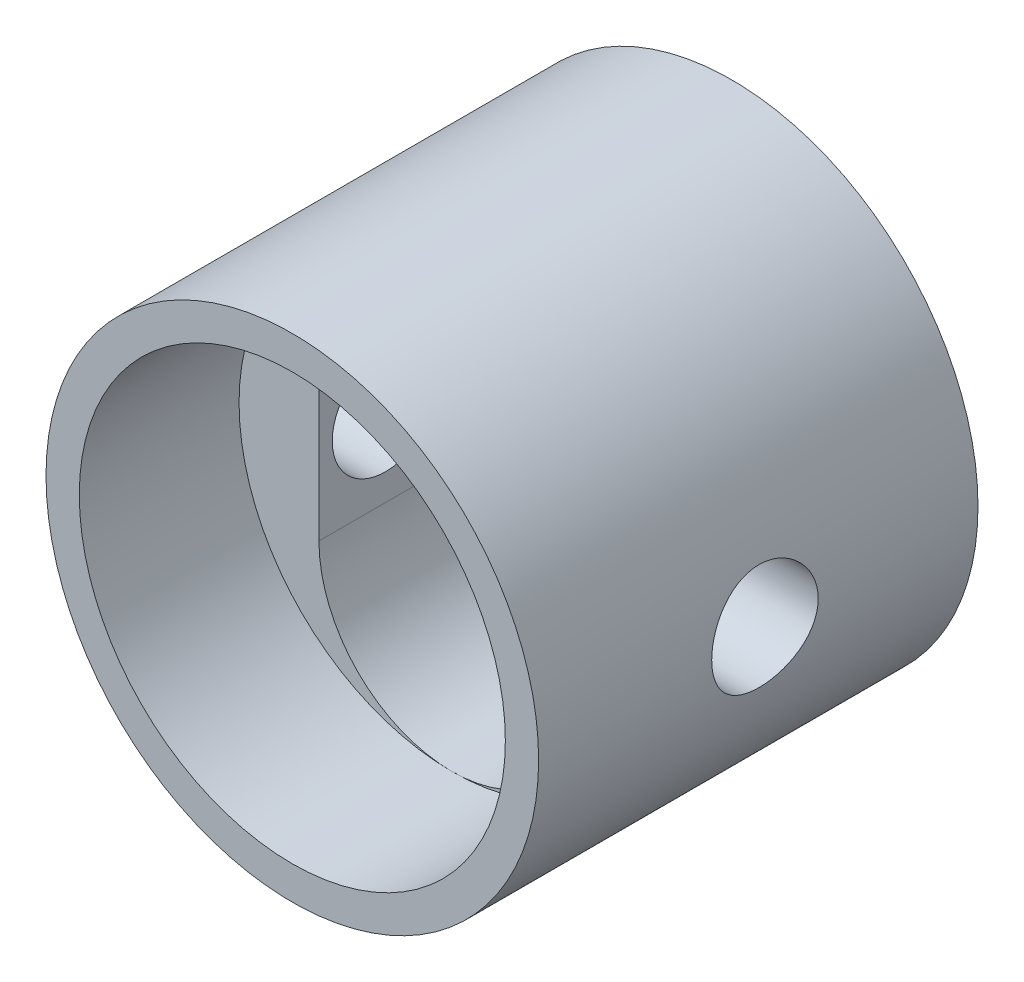
ISO-10303-21;
HEADER;
FILE_DESCRIPTION(('STEP AP214'),'2;1');
FILE_NAME('part.step','',(''),(''),'','','');
FILE_SCHEMA(('AUTOMOTIVE_DESIGN { 1 0 10303 214 1 1 1 1 }'));
ENDSEC;
DATA;
#1=APPLICATION_CONTEXT('core data for automotive mechanical design processes');
#2=APPLICATION_PROTOCOL_DEFINITION('international standard','automotive_design',2000,#1);
#3=PRODUCT_CONTEXT('',#1,'mechanical');
#4=PRODUCT('Part','Part','',(#3));
#5=PRODUCT_RELATED_PRODUCT_CATEGORY('part','',(#4));
#6=PRODUCT_DEFINITION_FORMATION('','',#4);
#7=PRODUCT_DEFINITION_CONTEXT('part definition',#1,'design');
#8=PRODUCT_DEFINITION('design','',#6,#7);
#9=PRODUCT_DEFINITION_SHAPE('','',#8);
#10=(LENGTH_UNIT() NAMED_UNIT(*) SI_UNIT(.MILLI.,.METRE.));
#11=(NAMED_UNIT(*) PLANE_ANGLE_UNIT() SI_UNIT($,.RADIAN.));
#12=(NAMED_UNIT(*) SI_UNIT($,.STERADIAN.) SOLID_ANGLE_UNIT());
#13=UNCERTAINTY_MEASURE_WITH_UNIT(LENGTH_MEASURE(1.E-05),#10,'distance_accuracy_value','');
#14=(GEOMETRIC_REPRESENTATION_CONTEXT(3) GLOBAL_UNCERTAINTY_ASSIGNED_CONTEXT((#13)) GLOBAL_UNIT_ASSIGNED_CONTEXT((#10,
#11,#12)) REPRESENTATION_CONTEXT('',''));
#15=CARTESIAN_POINT('',(0.,0.,0.));
#16=DIRECTION('',(0.,0.,1.));
#17=DIRECTION('',(1.,0.,0.));
#18=AXIS2_PLACEMENT_3D('',#15,#16,#17);
#19=CARTESIAN_POINT('',(-9.25,0.,8.));
#20=DIRECTION('',(1.,0.,0.));
#21=DIRECTION('',(0.,0.,-1.));
#22=AXIS2_PLACEMENT_3D('',#19,#20,#21);
#23=CYLINDRICAL_SURFACE('',#22,2.);
#24=CARTESIAN_POINT('',(9.25,0.,6.));
#25=CARTESIAN_POINT('',(9.24999794966675,-0.110956999554289,6.00000383274787));
#26=CARTESIAN_POINT('',(9.24798323201969,-0.221960602443484,6.00926476899194));
#27=CARTESIAN_POINT('',(9.24014068551821,-0.440816923666775,6.04602662679097));
#28=CARTESIAN_POINT('',(9.23431008963247,-0.548667296147383,6.07354078461527));
#29=CARTESIAN_POINT('',(9.21948523905599,-0.758022402348037,6.14590871999859));
#30=CARTESIAN_POINT('',(9.21049425207232,-0.859533563351223,6.19074459238393));
#31=CARTESIAN_POINT('',(9.19031997218462,-1.05358846203571,6.29642690115971));
#32=CARTESIAN_POINT('',(9.17913674615705,-1.14613247314033,6.35727284916599));
#33=CARTESIAN_POINT('',(9.15560756841307,-1.32108311221692,6.49425932597929));
#34=CARTESIAN_POINT('',(9.14324747062916,-1.40332878068311,6.57060301063516));
#35=CARTESIAN_POINT('',(9.1188577295497,-1.55395268470113,6.73598162318975));
#36=CARTESIAN_POINT('',(9.10682811526657,-1.6223297060972,6.82501766110254));
#37=CARTESIAN_POINT('',(9.08432209620077,-1.74398203162957,7.01443919359432));
#38=CARTESIAN_POINT('',(9.07386382867547,-1.79708663244037,7.11493666629615));
#39=CARTESIAN_POINT('',(9.05588738088086,-1.88559188954364,7.32369249222342));
#40=CARTESIAN_POINT('',(9.04836885769875,-1.92099461084442,7.43194993852571));
#41=CARTESIAN_POINT('',(9.03726711467375,-1.97256050309853,7.65140859853476));
#42=CARTESIAN_POINT('',(9.03362574019771,-1.98900830377848,7.76253992880423));
#43=CARTESIAN_POINT('',(9.03051587338792,-2.00308235312927,7.98603973041986));
#44=CARTESIAN_POINT('',(9.0310468802482,-2.00071086065718,8.09840805167469));
#45=CARTESIAN_POINT('',(9.03616910352368,-1.97744284409101,8.31908080983838));
#46=CARTESIAN_POINT('',(9.04068798042495,-1.95687635862998,8.42742197947588));
#47=CARTESIAN_POINT('',(9.05316247296601,-1.8983247765278,8.63907893834238));
#48=CARTESIAN_POINT('',(9.06111827746525,-1.86033872267287,8.74239445106396));
#49=CARTESIAN_POINT('',(9.07964186264922,-1.76772157067038,8.94199839500783));
#50=CARTESIAN_POINT('',(9.09022952118122,-1.71296302668127,9.03822576933256));
#51=CARTESIAN_POINT('',(9.1128115823854,-1.58844494332687,9.2202483652264));
#52=CARTESIAN_POINT('',(9.12480617256772,-1.51868340338818,9.30604219314424));
#53=CARTESIAN_POINT('',(9.14916140903538,-1.3643897669567,9.46666306167244));
#54=CARTESIAN_POINT('',(9.16152443674301,-1.27957688062143,9.54122027285588));
#55=CARTESIAN_POINT('',(9.1849927197008,-1.09851231683078,9.67509621793996));
#56=CARTESIAN_POINT('',(9.19609795316312,-1.0022604412855,9.73441468789383));
#57=CARTESIAN_POINT('',(9.21583415150842,-0.800724906050496,9.8361936468991));
#58=CARTESIAN_POINT('',(9.22446000908748,-0.695423175522405,9.87861940664156));
#59=CARTESIAN_POINT('',(9.23822749449848,-0.478957576675227,9.94509996722473));
#60=CARTESIAN_POINT('',(9.24336961716492,-0.367794543322361,9.96915737719276));
#61=CARTESIAN_POINT('',(9.24952003263802,-0.145076950397108,9.99782732611508));
#62=CARTESIAN_POINT('',(9.25060669400178,-0.0335719524450428,10.0028085473428));
#63=CARTESIAN_POINT('',(9.24874309064855,0.188676902036361,9.99418312825681));
#64=CARTESIAN_POINT('',(9.24579309316827,0.299420808464038,9.98057771842368));
#65=CARTESIAN_POINT('',(9.23623703714125,0.515786774196932,9.93547104862708));
#66=CARTESIAN_POINT('',(9.22967038482664,0.621450920167539,9.90416258075875));
#67=CARTESIAN_POINT('',(9.21361577516903,0.826028138121718,9.82475205707905));
#68=CARTESIAN_POINT('',(9.20412757290299,0.92494064324359,9.77664859324317));
#69=CARTESIAN_POINT('',(9.18308872202326,1.11473555026371,9.66424131909347));
#70=CARTESIAN_POINT('',(9.17151106373109,1.20548617321287,9.59972017257208));
#71=CARTESIAN_POINT('',(9.1476337850306,1.37500448099117,9.4565959079922));
#72=CARTESIAN_POINT('',(9.13533407327891,1.45377064517986,9.37799100567609));
#73=CARTESIAN_POINT('',(9.11112915379982,1.5985369840726,9.20724051817859));
#74=CARTESIAN_POINT('',(9.09923501591213,1.66428215524269,9.11487687780171));
#75=CARTESIAN_POINT('',(9.07744088501357,1.7793283340005,8.92020218664516));
#76=CARTESIAN_POINT('',(9.06754080642727,1.82863004732199,8.81789156302173));
#77=CARTESIAN_POINT('',(9.05094883799947,1.90906080777838,8.60677243368706));
#78=CARTESIAN_POINT('',(9.04423910878972,1.94029112241061,8.49800397905767));
#79=CARTESIAN_POINT('',(9.03475453351345,1.98399084030599,8.27659984126328));
#80=CARTESIAN_POINT('',(9.03197907470359,1.99646316505262,8.16396476310531));
#81=CARTESIAN_POINT('',(9.03071527038807,2.00217073967051,7.94059423204796));
#82=CARTESIAN_POINT('',(9.03213686289308,1.99581010612616,7.82986942248442));
#83=CARTESIAN_POINT('',(9.03890364291314,1.96493415114817,7.61110917498759));
#84=CARTESIAN_POINT('',(9.04424878636104,1.9404190336156,7.50307370686319));
#85=CARTESIAN_POINT('',(9.05821699871205,1.87412321733468,7.293071014374));
#86=CARTESIAN_POINT('',(9.06682913756271,1.83240004964036,7.19108485294636));
#87=CARTESIAN_POINT('',(9.08636550676729,1.73292240650147,6.9954996446446));
#88=CARTESIAN_POINT('',(9.09728997160911,1.67516630500708,6.90190144974698));
#89=CARTESIAN_POINT('',(9.12049002487242,1.54391636178594,6.7237541219008));
#90=CARTESIAN_POINT('',(9.13278805390871,1.47013397721891,6.6394204548384));
#91=CARTESIAN_POINT('',(9.1571973798904,1.30951219187948,6.48419862894206));
#92=CARTESIAN_POINT('',(9.16930863306619,1.22266978034484,6.4133135789971));
#93=CARTESIAN_POINT('',(9.19216084935319,1.03707347565252,6.28614670280268));
#94=CARTESIAN_POINT('',(9.20288260170888,0.938183155441215,6.23006034918784));
#95=CARTESIAN_POINT('',(9.22155560118258,0.732169196903626,6.1353938677496));
#96=CARTESIAN_POINT('',(9.2295091947954,0.62505262624536,6.09679890450998));
#97=CARTESIAN_POINT('',(9.2403129683777,0.431508140570168,6.04517263538498));
#98=CARTESIAN_POINT('',(9.24392327918513,0.346135334934019,6.02826491882594));
#99=CARTESIAN_POINT('',(9.24876754785876,0.173851179863895,6.00567733771006));
#100=CARTESIAN_POINT('',(9.2500016065301,0.0869398958529561,5.99999699686634));
#101=CARTESIAN_POINT('',(9.25,0.,6.));
#102=B_SPLINE_CURVE_WITH_KNOTS('',3,(#24,#25,#26,#27,#28,#29,#30,#31,#32,#33,#34,#35,#36,#37,
#38,#39,#40,#41,#42,#43,#44,#45,#46,#47,#48,#49,#50,#51,#52,#53,#54,#55,#56,#57,#58,#59,#60,#61,
#62,#63,#64,#65,#66,#67,#68,#69,#70,#71,#72,#73,#74,#75,#76,#77,#78,#79,#80,#81,#82,#83,#84,#85,
#86,#87,#88,#89,#90,#91,#92,#93,#94,#95,#96,#97,#98,#99,#100,#101),.UNSPECIFIED.,.T.,.F.,(4,2,2,
2,2,2,2,2,2,2,2,2,2,2,2,2,2,2,2,2,2,2,2,2,2,2,2,2,2,2,2,2,2,2,2,2,2,2,4),(0.,0.332552789439911,
0.665346992521898,0.997798108133428,1.33023908356562,1.66735766161235,2.00450574058717,
2.34528747912598,2.68602945457644,3.02158524796738,3.35710076561031,3.68665237013801,
4.01622208585779,4.34836091722077,4.68054406510321,5.01974160431334,5.35894501829084,
5.69884223548806,6.03869116308923,6.3719377311684,6.7051622385749,7.03482584603445,
7.36451709779607,7.69882313115479,8.03317154741184,8.37353170865235,8.7138772601566,
9.0522966564636,9.39066333981451,9.72182235229221,10.0529776454328,10.3830346599929,
10.7131251609604,11.0497411059696,11.3864347712293,11.7273752611114,12.0680260368238,
12.3286074474711,12.5891778035158),.UNSPECIFIED.);
#103=CARTESIAN_POINT('',(9.25,0.,6.));
#104=VERTEX_POINT('',#103);
#105=EDGE_CURVE('E140',#104,#104,#102,.T.);
#106=ORIENTED_EDGE('',*,*,#105,.F.);
#107=EDGE_LOOP('',(#106));
#108=FACE_BOUND('',#107,.T.);
#109=CARTESIAN_POINT('',(5.,0.,8.));
#110=DIRECTION('',(-1.,0.,0.));
#111=DIRECTION('',(0.,0.,1.));
#112=AXIS2_PLACEMENT_3D('',#109,#110,#111);
#113=CIRCLE('',#112,2.);
#114=CARTESIAN_POINT('',(5.,0.,10.));
#115=VERTEX_POINT('',#114);
#116=EDGE_CURVE('E122',#115,#115,#113,.F.);
#117=ORIENTED_EDGE('',*,*,#116,.F.);
#118=EDGE_LOOP('',(#117));
#119=FACE_BOUND('',#118,.T.);
#120=ADVANCED_FACE('F34',(#108,#119),#23,.F.);
#121=CARTESIAN_POINT('',(0.,0.,10.5));
#122=DIRECTION('',(0.,0.,1.));
#123=DIRECTION('',(1.,0.,0.));
#124=AXIS2_PLACEMENT_3D('',#121,#122,#123);
#125=PLANE('',#124);
#126=DIRECTION('',(0.,-1.,0.));
#127=VECTOR('',#126,1.);
#128=CARTESIAN_POINT('',(-5.,3.,10.5));
#129=LINE('',#128,#127);
#130=CARTESIAN_POINT('',(-5.,3.,10.5));
#131=VERTEX_POINT('',#130);
#132=CARTESIAN_POINT('',(-5.,-3.,10.5));
#133=VERTEX_POINT('',#132);
#134=EDGE_CURVE('E102',#131,#133,#129,.T.);
#135=ORIENTED_EDGE('',*,*,#134,.F.);
#136=CARTESIAN_POINT('',(0.,3.,10.5));
#137=DIRECTION('',(0.,0.,1.));
#138=DIRECTION('',(1.,0.,0.));
#139=AXIS2_PLACEMENT_3D('',#136,#137,#138);
#140=CIRCLE('',#139,5.);
#141=CARTESIAN_POINT('',(0.,8.,10.5));
#142=VERTEX_POINT('',#141);
#143=EDGE_CURVE('E12',#142,#131,#140,.T.);
#144=ORIENTED_EDGE('',*,*,#143,.F.);
#145=CARTESIAN_POINT('',(0.,0.,10.5));
#146=DIRECTION('',(0.,0.,1.));
#147=DIRECTION('',(1.,0.,0.));
#148=AXIS2_PLACEMENT_3D('',#145,#146,#147);
#149=CIRCLE('',#148,8.);
#150=CARTESIAN_POINT('',(0.,-8.,10.5));
#151=VERTEX_POINT('',#150);
#152=EDGE_CURVE('E131',#142,#151,#149,.T.);
#153=ORIENTED_EDGE('',*,*,#152,.T.);
#154=CARTESIAN_POINT('',(0.,-3.,10.5));
#155=DIRECTION('',(0.,0.,1.));
#156=DIRECTION('',(1.,0.,0.));
#157=AXIS2_PLACEMENT_3D('',#154,#155,#156);
#158=CIRCLE('',#157,5.);
#159=EDGE_CURVE('E57',#133,#151,#158,.T.);
#160=ORIENTED_EDGE('',*,*,#159,.F.);
#161=EDGE_LOOP('',(#135,#144,#153,#160));
#162=FACE_BOUND('',#161,.T.);
#163=ADVANCED_FACE('F164',(#162),#125,.T.);
#164=CARTESIAN_POINT('',(0.,0.,16.5));
#165=DIRECTION('',(0.,0.,-1.));
#166=DIRECTION('',(-1.,0.,0.));
#167=AXIS2_PLACEMENT_3D('',#164,#165,#166);
#168=CYLINDRICAL_SURFACE('',#167,9.25);
#169=CARTESIAN_POINT('',(-9.25,0.,10.));
#170=CARTESIAN_POINT('',(-9.24999794966675,-0.110956999554289,9.99999616725213));
#171=CARTESIAN_POINT('',(-9.24798323201969,-0.221960602443484,9.99073523100806));
#172=CARTESIAN_POINT('',(-9.24014068551821,-0.440816923666775,9.95397337320903));
#173=CARTESIAN_POINT('',(-9.23431008963247,-0.548667296147383,9.92645921538474));
#174=CARTESIAN_POINT('',(-9.21948523905599,-0.758022402348037,9.85409128000141));
#175=CARTESIAN_POINT('',(-9.21049425207232,-0.859533563351223,9.80925540761607));
#176=CARTESIAN_POINT('',(-9.19031997218462,-1.05358846203572,9.70357309884029));
#177=CARTESIAN_POINT('',(-9.17913674615705,-1.14613247314033,9.64272715083401));
#178=CARTESIAN_POINT('',(-9.15560756841307,-1.32108311221692,9.50574067402071));
#179=CARTESIAN_POINT('',(-9.14324747062916,-1.40332878068311,9.42939698936484));
#180=CARTESIAN_POINT('',(-9.1188577295497,-1.55395268470113,9.26401837681025));
#181=CARTESIAN_POINT('',(-9.10682811526658,-1.6223297060972,9.17498233889746));
#182=CARTESIAN_POINT('',(-9.08432209620077,-1.74398203162957,8.98556080640568));
#183=CARTESIAN_POINT('',(-9.07386382867547,-1.79708663244037,8.88506333370385));
#184=CARTESIAN_POINT('',(-9.05588738088086,-1.88559188954364,8.67630750777658));
#185=CARTESIAN_POINT('',(-9.04836885769875,-1.92099461084442,8.56805006147429));
#186=CARTESIAN_POINT('',(-9.03726711467375,-1.97256050309853,8.34859140146524));
#187=CARTESIAN_POINT('',(-9.03362574019771,-1.98900830377848,8.23746007119577));
#188=CARTESIAN_POINT('',(-9.03051587338792,-2.00308235312927,8.01396026958015));
#189=CARTESIAN_POINT('',(-9.0310468802482,-2.00071086065718,7.90159194832531));
#190=CARTESIAN_POINT('',(-9.03616910352368,-1.97744284409101,7.68091919016162));
#191=CARTESIAN_POINT('',(-9.04068798042495,-1.95687635862998,7.57257802052412));
#192=CARTESIAN_POINT('',(-9.05316247296601,-1.8983247765278,7.36092106165762));
#193=CARTESIAN_POINT('',(-9.06111827746525,-1.86033872267287,7.25760554893604));
#194=CARTESIAN_POINT('',(-9.07964186264922,-1.76772157067038,7.05800160499217));
#195=CARTESIAN_POINT('',(-9.09022952118122,-1.71296302668127,6.96177423066743));
#196=CARTESIAN_POINT('',(-9.1128115823854,-1.58844494332687,6.7797516347736));
#197=CARTESIAN_POINT('',(-9.12480617256772,-1.51868340338818,6.69395780685576));
#198=CARTESIAN_POINT('',(-9.14916140903538,-1.3643897669567,6.53333693832756));
#199=CARTESIAN_POINT('',(-9.16152443674301,-1.27957688062143,6.45877972714412));
#200=CARTESIAN_POINT('',(-9.1849927197008,-1.09851231683078,6.32490378206004));
#201=CARTESIAN_POINT('',(-9.19609795316312,-1.00226044128549,6.26558531210617));
#202=CARTESIAN_POINT('',(-9.21583415150842,-0.800724906050495,6.1638063531009));
#203=CARTESIAN_POINT('',(-9.22446000908748,-0.695423175522404,6.12138059335844));
#204=CARTESIAN_POINT('',(-9.23822749449848,-0.478957576675226,6.05490003277527));
#205=CARTESIAN_POINT('',(-9.24336961716492,-0.367794543322359,6.03084262280724));
#206=CARTESIAN_POINT('',(-9.24952003263802,-0.145076950397107,6.00217267388492));
#207=CARTESIAN_POINT('',(-9.25060669400178,-0.0335719524450409,5.99719145265717));
#208=CARTESIAN_POINT('',(-9.24874309064855,0.188676902036363,6.00581687174319));
#209=CARTESIAN_POINT('',(-9.24579309316827,0.29942080846404,6.01942228157632));
#210=CARTESIAN_POINT('',(-9.23623703714125,0.515786774196934,6.06452895137292));
#211=CARTESIAN_POINT('',(-9.22967038482664,0.62145092016754,6.09583741924126));
#212=CARTESIAN_POINT('',(-9.21361577516903,0.82602813812172,6.17524794292095));
#213=CARTESIAN_POINT('',(-9.20412757290299,0.924940643243592,6.22335140675683));
#214=CARTESIAN_POINT('',(-9.18308872202326,1.11473555026371,6.33575868090653));
#215=CARTESIAN_POINT('',(-9.17151106373109,1.20548617321287,6.40027982742792));
#216=CARTESIAN_POINT('',(-9.1476337850306,1.37500448099117,6.54340409200781));
#217=CARTESIAN_POINT('',(-9.1353340732789,1.45377064517987,6.62200899432391));
#218=CARTESIAN_POINT('',(-9.11112915379982,1.5985369840726,6.79275948182141));
#219=CARTESIAN_POINT('',(-9.09923501591213,1.66428215524269,6.8851231221983));
#220=CARTESIAN_POINT('',(-9.07744088501357,1.7793283340005,7.07979781335484));
#221=CARTESIAN_POINT('',(-9.06754080642726,1.82863004732199,7.18210843697827));
#222=CARTESIAN_POINT('',(-9.05094883799947,1.90906080777838,7.39322756631294));
#223=CARTESIAN_POINT('',(-9.04423910878972,1.94029112241061,7.50199602094234));
#224=CARTESIAN_POINT('',(-9.03475453351345,1.98399084030599,7.72340015873672));
#225=CARTESIAN_POINT('',(-9.03197907470359,1.99646316505262,7.83603523689469));
#226=CARTESIAN_POINT('',(-9.03071527038807,2.00217073967051,8.05940576795204));
#227=CARTESIAN_POINT('',(-9.03213686289308,1.99581010612616,8.17013057751558));
#228=CARTESIAN_POINT('',(-9.03890364291315,1.96493415114817,8.38889082501242));
#229=CARTESIAN_POINT('',(-9.04424878636104,1.9404190336156,8.49692629313681));
#230=CARTESIAN_POINT('',(-9.05821699871205,1.87412321733467,8.70692898562601));
#231=CARTESIAN_POINT('',(-9.06682913756271,1.83240004964036,8.80891514705365));
#232=CARTESIAN_POINT('',(-9.08636550676729,1.73292240650147,9.00450035535541));
#233=CARTESIAN_POINT('',(-9.09728997160911,1.67516630500707,9.09809855025302));
#234=CARTESIAN_POINT('',(-9.12049002487242,1.54391636178593,9.2762458780992));
#235=CARTESIAN_POINT('',(-9.13278805390871,1.4701339772189,9.3605795451616));
#236=CARTESIAN_POINT('',(-9.1571973798904,1.30951219187948,9.51580137105794));
#237=CARTESIAN_POINT('',(-9.1693086330662,1.22266978034484,9.58668642100291));
#238=CARTESIAN_POINT('',(-9.19216084935319,1.03707347565252,9.71385329719732));
#239=CARTESIAN_POINT('',(-9.20288260170888,0.938183155441214,9.76993965081216));
#240=CARTESIAN_POINT('',(-9.22155560118258,0.732169196903625,9.8646061322504));
#241=CARTESIAN_POINT('',(-9.22950919479541,0.625052626245358,9.90320109549002));
#242=CARTESIAN_POINT('',(-9.2403129683777,0.431508140570165,9.95482736461502));
#243=CARTESIAN_POINT('',(-9.24392327918513,0.346135334934017,9.97173508117406));
#244=CARTESIAN_POINT('',(-9.24876754785876,0.173851179863894,9.99432266228994));
#245=CARTESIAN_POINT('',(-9.2500016065301,0.0869398958529555,10.0000030031337));
#246=CARTESIAN_POINT('',(-9.25,0.,10.));
#247=B_SPLINE_CURVE_WITH_KNOTS('',3,(#169,#170,#171,#172,#173,#174,#175,#176,#177,#178,#179,
#180,#181,#182,#183,#184,#185,#186,#187,#188,#189,#190,#191,#192,#193,#194,#195,#196,#197,#198,
#199,#200,#201,#202,#203,#204,#205,#206,#207,#208,#209,#210,#211,#212,#213,#214,#215,#216,#217,
#218,#219,#220,#221,#222,#223,#224,#225,#226,#227,#228,#229,#230,#231,#232,#233,#234,#235,#236,
#237,#238,#239,#240,#241,#242,#243,#244,#245,#246),.UNSPECIFIED.,.T.,.F.,(4,2,2,2,2,2,2,2,2,2,2,
2,2,2,2,2,2,2,2,2,2,2,2,2,2,2,2,2,2,2,2,2,2,2,2,2,2,2,4),(0.,0.332552789439911,
0.665346992521898,0.997798108133428,1.33023908356562,1.66735766161235,2.00450574058717,
2.34528747912598,2.68602945457644,3.02158524796738,3.35710076561031,3.68665237013801,
4.01622208585779,4.34836091722078,4.68054406510321,5.01974160431335,5.35894501829084,
5.69884223548806,6.03869116308923,6.37193773116841,6.70516223857491,7.03482584603445,
7.36451709779608,7.69882313115479,8.03317154741184,8.37353170865235,8.7138772601566,
9.0522966564636,9.39066333981451,9.72182235229221,10.0529776454328,10.3830346599929,
10.7131251609604,11.0497411059696,11.3864347712293,11.7273752611114,12.0680260368238,
12.3286074474711,12.5891778035158),.UNSPECIFIED.);
#248=CARTESIAN_POINT('',(-9.25,0.,10.));
#249=VERTEX_POINT('',#248);
#250=EDGE_CURVE('E146',#249,#249,#247,.T.);
#251=ORIENTED_EDGE('',*,*,#250,.T.);
#252=EDGE_LOOP('',(#251));
#253=FACE_BOUND('',#252,.T.);
#254=ORIENTED_EDGE('',*,*,#105,.T.);
#255=EDGE_LOOP('',(#254));
#256=FACE_BOUND('',#255,.T.);
#257=CARTESIAN_POINT('',(0.,0.,16.5));
#258=DIRECTION('',(0.,0.,1.));
#259=DIRECTION('',(1.,0.,0.));
#260=AXIS2_PLACEMENT_3D('',#257,#258,#259);
#261=CIRCLE('',#260,9.25);
#262=CARTESIAN_POINT('',(9.25,0.,16.5));
#263=VERTEX_POINT('',#262);
#264=EDGE_CURVE('E137',#263,#263,#261,.T.);
#265=ORIENTED_EDGE('',*,*,#264,.F.);
#266=EDGE_LOOP('',(#265));
#267=FACE_BOUND('',#266,.T.);
#268=CARTESIAN_POINT('',(0.,0.,0.));
#269=DIRECTION('',(0.,0.,1.));
#270=DIRECTION('',(1.,0.,0.));
#271=AXIS2_PLACEMENT_3D('',#268,#269,#270);
#272=CIRCLE('',#271,9.25);
#273=CARTESIAN_POINT('',(9.25,0.,0.));
#274=VERTEX_POINT('',#273);
#275=EDGE_CURVE('E133',#274,#274,#272,.T.);
#276=ORIENTED_EDGE('',*,*,#275,.T.);
#277=EDGE_LOOP('',(#276));
#278=FACE_BOUND('',#277,.T.);
#279=ADVANCED_FACE('F36',(#253,#256,#267,#278),#168,.T.);
#280=CARTESIAN_POINT('',(0.,0.,16.5));
#281=DIRECTION('',(0.,0.,1.));
#282=DIRECTION('',(1.,0.,0.));
#283=AXIS2_PLACEMENT_3D('',#280,#281,#282);
#284=PLANE('',#283);
#285=CARTESIAN_POINT('',(0.,0.,16.5));
#286=DIRECTION('',(0.,0.,1.));
#287=DIRECTION('',(1.,0.,0.));
#288=AXIS2_PLACEMENT_3D('',#285,#286,#287);
#289=CIRCLE('',#288,8.);
#290=CARTESIAN_POINT('',(8.,0.,16.5));
#291=VERTEX_POINT('',#290);
#292=EDGE_CURVE('E128',#291,#291,#289,.T.);
#293=ORIENTED_EDGE('',*,*,#292,.F.);
#294=EDGE_LOOP('',(#293));
#295=FACE_BOUND('',#294,.T.);
#296=ORIENTED_EDGE('',*,*,#264,.T.);
#297=EDGE_LOOP('',(#296));
#298=FACE_BOUND('',#297,.T.);
#299=ADVANCED_FACE('F160',(#295,#298),#284,.T.);
#300=CARTESIAN_POINT('',(0.,0.,0.));
#301=DIRECTION('',(0.,0.,1.));
#302=DIRECTION('',(1.,0.,0.));
#303=AXIS2_PLACEMENT_3D('',#300,#301,#302);
#304=PLANE('',#303);
#305=ORIENTED_EDGE('',*,*,#275,.F.);
#306=EDGE_LOOP('',(#305));
#307=FACE_BOUND('',#306,.T.);
#308=ADVANCED_FACE('F155',(#307),#304,.F.);
#309=CARTESIAN_POINT('',(-5.,0.,8.));
#310=DIRECTION('',(-1.,0.,0.));
#311=DIRECTION('',(0.,0.,1.));
#312=AXIS2_PLACEMENT_3D('',#309,#310,#311);
#313=CIRCLE('',#312,2.);
#314=CARTESIAN_POINT('',(-5.,0.,10.));
#315=VERTEX_POINT('',#314);
#316=EDGE_CURVE('E125',#315,#315,#313,.F.);
#317=ORIENTED_EDGE('',*,*,#316,.T.);
#318=EDGE_LOOP('',(#317));
#319=FACE_BOUND('',#318,.T.);
#320=ORIENTED_EDGE('',*,*,#250,.F.);
#321=EDGE_LOOP('',(#320));
#322=FACE_BOUND('',#321,.T.);
#323=ADVANCED_FACE('F149',(#319,#322),#23,.F.);
#324=CARTESIAN_POINT('',(0.,0.,10.5));
#325=DIRECTION('',(0.,0.,1.));
#326=DIRECTION('',(1.,0.,0.));
#327=AXIS2_PLACEMENT_3D('',#324,#325,#326);
#328=CYLINDRICAL_SURFACE('',#327,8.);
#329=ORIENTED_EDGE('',*,*,#152,.F.);
#330=EDGE_CURVE('E100',#151,#142,#149,.T.);
#331=ORIENTED_EDGE('',*,*,#330,.F.);
#332=EDGE_LOOP('',(#329,#331));
#333=FACE_BOUND('',#332,.T.);
#334=ORIENTED_EDGE('',*,*,#292,.T.);
#335=EDGE_LOOP('',(#334));
#336=FACE_BOUND('',#335,.T.);
#337=ADVANCED_FACE('F154',(#333,#336),#328,.F.);
#338=CARTESIAN_POINT('',(0.,-3.,10.5));
#339=DIRECTION('',(0.,0.,1.));
#340=DIRECTION('',(1.,0.,0.));
#341=AXIS2_PLACEMENT_3D('',#338,#339,#340);
#342=CIRCLE('',#341,5.);
#343=CARTESIAN_POINT('',(5.,-3.,10.5));
#344=VERTEX_POINT('',#343);
#345=EDGE_CURVE('E39',#151,#344,#342,.T.);
#346=ORIENTED_EDGE('',*,*,#345,.F.);
#347=ORIENTED_EDGE('',*,*,#330,.T.);
#348=CARTESIAN_POINT('',(0.,3.,10.5));
#349=DIRECTION('',(0.,0.,1.));
#350=DIRECTION('',(1.,0.,0.));
#351=AXIS2_PLACEMENT_3D('',#348,#349,#350);
#352=CIRCLE('',#351,5.);
#353=CARTESIAN_POINT('',(5.,3.,10.5));
#354=VERTEX_POINT('',#353);
#355=EDGE_CURVE('E84',#354,#142,#352,.T.);
#356=ORIENTED_EDGE('',*,*,#355,.F.);
#357=DIRECTION('',(0.,-1.,0.));
#358=VECTOR('',#357,1.);
#359=CARTESIAN_POINT('',(5.,3.,10.5));
#360=LINE('',#359,#358);
#361=EDGE_CURVE('E92',#354,#344,#360,.T.);
#362=ORIENTED_EDGE('',*,*,#361,.T.);
#363=EDGE_LOOP('',(#346,#347,#356,#362));
#364=FACE_BOUND('',#363,.T.);
#365=ADVANCED_FACE('F98',(#364),#125,.T.);
#366=CARTESIAN_POINT('',(-5.,3.,0.5));
#367=DIRECTION('',(-1.,0.,0.));
#368=DIRECTION('',(0.,0.,1.));
#369=AXIS2_PLACEMENT_3D('',#366,#367,#368);
#370=PLANE('',#369);
#371=DIRECTION('',(0.,0.,1.));
#372=VECTOR('',#371,1.);
#373=CARTESIAN_POINT('',(-5.,3.,0.5));
#374=LINE('',#373,#372);
#375=CARTESIAN_POINT('',(-5.,3.,0.5));
#376=VERTEX_POINT('',#375);
#377=EDGE_CURVE('E89',#376,#131,#374,.T.);
#378=ORIENTED_EDGE('',*,*,#377,.T.);
#379=ORIENTED_EDGE('',*,*,#134,.T.);
#380=DIRECTION('',(0.,0.,1.));
#381=VECTOR('',#380,1.);
#382=CARTESIAN_POINT('',(-5.,-3.,0.5));
#383=LINE('',#382,#381);
#384=CARTESIAN_POINT('',(-5.,-3.,0.5));
#385=VERTEX_POINT('',#384);
#386=EDGE_CURVE('E120',#385,#133,#383,.T.);
#387=ORIENTED_EDGE('',*,*,#386,.F.);
#388=DIRECTION('',(0.,-1.,0.));
#389=VECTOR('',#388,1.);
#390=CARTESIAN_POINT('',(-5.,3.,0.5));
#391=LINE('',#390,#389);
#392=EDGE_CURVE('E114',#376,#385,#391,.T.);
#393=ORIENTED_EDGE('',*,*,#392,.F.);
#394=EDGE_LOOP('',(#378,#379,#387,#393));
#395=FACE_BOUND('',#394,.T.);
#396=ORIENTED_EDGE('',*,*,#316,.F.);
#397=EDGE_LOOP('',(#396));
#398=FACE_BOUND('',#397,.T.);
#399=ADVANCED_FACE('F182',(#395,#398),#370,.F.);
#400=CARTESIAN_POINT('',(5.,3.,0.5));
#401=DIRECTION('',(-1.,0.,0.));
#402=DIRECTION('',(0.,0.,1.));
#403=AXIS2_PLACEMENT_3D('',#400,#401,#402);
#404=PLANE('',#403);
#405=DIRECTION('',(0.,-1.,0.));
#406=VECTOR('',#405,1.);
#407=CARTESIAN_POINT('',(5.,3.,0.5));
#408=LINE('',#407,#406);
#409=CARTESIAN_POINT('',(5.,3.,0.5));
#410=VERTEX_POINT('',#409);
#411=CARTESIAN_POINT('',(5.,-3.,0.5));
#412=VERTEX_POINT('',#411);
#413=EDGE_CURVE('E111',#410,#412,#408,.T.);
#414=ORIENTED_EDGE('',*,*,#413,.T.);
#415=DIRECTION('',(0.,0.,1.));
#416=VECTOR('',#415,1.);
#417=CARTESIAN_POINT('',(5.,-3.,0.5));
#418=LINE('',#417,#416);
#419=EDGE_CURVE('E50',#412,#344,#418,.T.);
#420=ORIENTED_EDGE('',*,*,#419,.T.);
#421=ORIENTED_EDGE('',*,*,#361,.F.);
#422=DIRECTION('',(0.,0.,1.));
#423=VECTOR('',#422,1.);
#424=CARTESIAN_POINT('',(5.,3.,0.5));
#425=LINE('',#424,#423);
#426=EDGE_CURVE('E81',#410,#354,#425,.T.);
#427=ORIENTED_EDGE('',*,*,#426,.F.);
#428=EDGE_LOOP('',(#414,#420,#421,#427));
#429=FACE_BOUND('',#428,.T.);
#430=ORIENTED_EDGE('',*,*,#116,.T.);
#431=EDGE_LOOP('',(#430));
#432=FACE_BOUND('',#431,.T.);
#433=ADVANCED_FACE('F93',(#429,#432),#404,.T.);
#434=CARTESIAN_POINT('',(0.,-3.,0.5));
#435=DIRECTION('',(0.,0.,1.));
#436=DIRECTION('',(1.,0.,0.));
#437=AXIS2_PLACEMENT_3D('',#434,#435,#436);
#438=CYLINDRICAL_SURFACE('',#437,5.);
#439=ORIENTED_EDGE('',*,*,#386,.T.);
#440=ORIENTED_EDGE('',*,*,#159,.T.);
#441=ORIENTED_EDGE('',*,*,#345,.T.);
#442=ORIENTED_EDGE('',*,*,#419,.F.);
#443=CARTESIAN_POINT('',(0.,-3.,0.5));
#444=DIRECTION('',(0.,0.,1.));
#445=DIRECTION('',(1.,0.,0.));
#446=AXIS2_PLACEMENT_3D('',#443,#444,#445);
#447=CIRCLE('',#446,5.);
#448=EDGE_CURVE('E105',#385,#412,#447,.T.);
#449=ORIENTED_EDGE('',*,*,#448,.F.);
#450=EDGE_LOOP('',(#439,#440,#441,#442,#449));
#451=FACE_BOUND('',#450,.T.);
#452=ADVANCED_FACE('F181',(#451),#438,.F.);
#453=CARTESIAN_POINT('',(0.,3.,0.5));
#454=DIRECTION('',(0.,0.,1.));
#455=DIRECTION('',(1.,0.,0.));
#456=AXIS2_PLACEMENT_3D('',#453,#454,#455);
#457=CYLINDRICAL_SURFACE('',#456,5.);
#458=ORIENTED_EDGE('',*,*,#426,.T.);
#459=ORIENTED_EDGE('',*,*,#355,.T.);
#460=ORIENTED_EDGE('',*,*,#143,.T.);
#461=ORIENTED_EDGE('',*,*,#377,.F.);
#462=CARTESIAN_POINT('',(0.,3.,0.5));
#463=DIRECTION('',(0.,0.,1.));
#464=DIRECTION('',(1.,0.,0.));
#465=AXIS2_PLACEMENT_3D('',#462,#463,#464);
#466=CIRCLE('',#465,5.);
#467=EDGE_CURVE('E87',#410,#376,#466,.T.);
#468=ORIENTED_EDGE('',*,*,#467,.F.);
#469=EDGE_LOOP('',(#458,#459,#460,#461,#468));
#470=FACE_BOUND('',#469,.T.);
#471=ADVANCED_FACE('F82',(#470),#457,.F.);
#472=CARTESIAN_POINT('',(0.,-3.,0.5));
#473=DIRECTION('',(0.,0.,1.));
#474=DIRECTION('',(1.,0.,0.));
#475=AXIS2_PLACEMENT_3D('',#472,#473,#474);
#476=PLANE('',#475);
#477=ORIENTED_EDGE('',*,*,#448,.T.);
#478=ORIENTED_EDGE('',*,*,#413,.F.);
#479=ORIENTED_EDGE('',*,*,#467,.T.);
#480=ORIENTED_EDGE('',*,*,#392,.T.);
#481=EDGE_LOOP('',(#477,#478,#479,#480));
#482=FACE_BOUND('',#481,.T.);
#483=ADVANCED_FACE('F194',(#482),#476,.T.);
#484=CLOSED_SHELL('',(#120,#163,#279,#299,#308,#323,#337,#365,#399,#433,#452,#471,#483));
#485=MANIFOLD_SOLID_BREP('B2',#484);
#486=ADVANCED_BREP_SHAPE_REPRESENTATION('',(#18,#485),#14);
#487=SHAPE_DEFINITION_REPRESENTATION(#9,#486);
ENDSEC;
END-ISO-10303-21;
